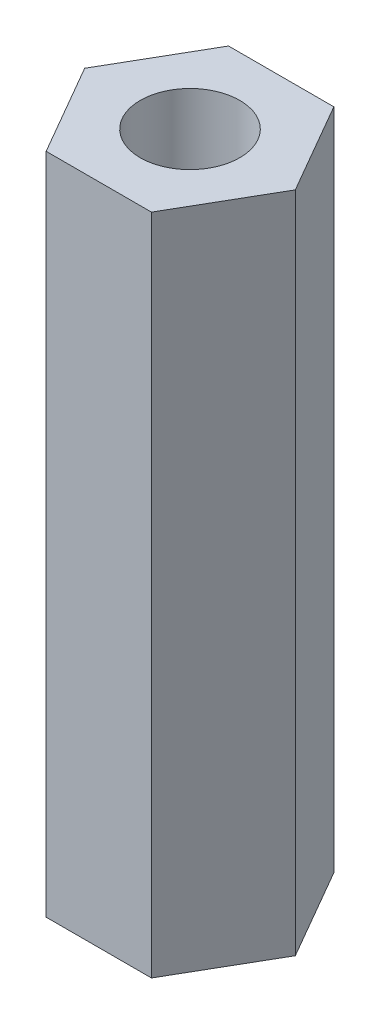
ISO-10303-21;
HEADER;
FILE_DESCRIPTION(('STEP AP214'),'2;1');
FILE_NAME('part.step','',(''),(''),'','','');
FILE_SCHEMA(('AUTOMOTIVE_DESIGN { 1 0 10303 214 1 1 1 1 }'));
ENDSEC;
DATA;
#1=APPLICATION_CONTEXT('core data for automotive mechanical design processes');
#2=APPLICATION_PROTOCOL_DEFINITION('international standard','automotive_design',2000,#1);
#3=PRODUCT_CONTEXT('',#1,'mechanical');
#4=PRODUCT('Part','Part','',(#3));
#5=PRODUCT_RELATED_PRODUCT_CATEGORY('part','',(#4));
#6=PRODUCT_DEFINITION_FORMATION('','',#4);
#7=PRODUCT_DEFINITION_CONTEXT('part definition',#1,'design');
#8=PRODUCT_DEFINITION('design','',#6,#7);
#9=PRODUCT_DEFINITION_SHAPE('','',#8);
#10=(LENGTH_UNIT() NAMED_UNIT(*) SI_UNIT(.MILLI.,.METRE.));
#11=(NAMED_UNIT(*) PLANE_ANGLE_UNIT() SI_UNIT($,.RADIAN.));
#12=(NAMED_UNIT(*) SI_UNIT($,.STERADIAN.) SOLID_ANGLE_UNIT());
#13=UNCERTAINTY_MEASURE_WITH_UNIT(LENGTH_MEASURE(1.E-05),#10,'distance_accuracy_value','');
#14=(GEOMETRIC_REPRESENTATION_CONTEXT(3) GLOBAL_UNCERTAINTY_ASSIGNED_CONTEXT((#13)) GLOBAL_UNIT_ASSIGNED_CONTEXT((#10,
#11,#12)) REPRESENTATION_CONTEXT('',''));
#15=CARTESIAN_POINT('',(0.,0.,0.));
#16=DIRECTION('',(0.,0.,1.));
#17=DIRECTION('',(1.,0.,0.));
#18=AXIS2_PLACEMENT_3D('',#15,#16,#17);
#19=CARTESIAN_POINT('',(0.,20.,0.));
#20=DIRECTION('',(0.,1.,0.));
#21=DIRECTION('',(0.,0.,1.));
#22=AXIS2_PLACEMENT_3D('',#19,#20,#21);
#23=PLANE('',#22);
#24=DIRECTION('',(0.5,0.,-0.866025403784439));
#25=VECTOR('',#24,1.);
#26=CARTESIAN_POINT('',(-5.73489304903012,20.,-4.82224059461863));
#27=LINE('',#26,#25);
#28=CARTESIAN_POINT('',(-5.73489304903012,20.,-4.82224059461863));
#29=VERTEX_POINT('',#28);
#30=CARTESIAN_POINT('',(-4.14717980875865,20.,-7.57224059461863));
#31=VERTEX_POINT('',#30);
#32=EDGE_CURVE('E146',#29,#31,#27,.T.);
#33=ORIENTED_EDGE('',*,*,#32,.T.);
#34=DIRECTION('',(-0.5,0.,-0.866025403784439));
#35=VECTOR('',#34,1.);
#36=CARTESIAN_POINT('',(-4.14717980875865,20.,-7.57224059461863));
#37=LINE('',#36,#35);
#38=CARTESIAN_POINT('',(-5.73489304903012,20.,-10.3222405946186));
#39=VERTEX_POINT('',#38);
#40=EDGE_CURVE('E94',#31,#39,#37,.T.);
#41=ORIENTED_EDGE('',*,*,#40,.T.);
#42=DIRECTION('',(-1.,0.,0.));
#43=VECTOR('',#42,1.);
#44=CARTESIAN_POINT('',(-5.73489304903012,20.,-10.3222405946186));
#45=LINE('',#44,#43);
#46=CARTESIAN_POINT('',(-8.91031952957306,20.,-10.3222405946186));
#47=VERTEX_POINT('',#46);
#48=EDGE_CURVE('E107',#39,#47,#45,.T.);
#49=ORIENTED_EDGE('',*,*,#48,.T.);
#50=DIRECTION('',(-0.5,0.,0.866025403784439));
#51=VECTOR('',#50,1.);
#52=CARTESIAN_POINT('',(-8.91031952957306,20.,-10.3222405946186));
#53=LINE('',#52,#51);
#54=CARTESIAN_POINT('',(-10.4980327698445,20.,-7.57224059461863));
#55=VERTEX_POINT('',#54);
#56=EDGE_CURVE('E101',#47,#55,#53,.T.);
#57=ORIENTED_EDGE('',*,*,#56,.T.);
#58=DIRECTION('',(0.5,0.,0.866025403784439));
#59=VECTOR('',#58,1.);
#60=CARTESIAN_POINT('',(-10.4980327698445,20.,-7.57224059461863));
#61=LINE('',#60,#59);
#62=CARTESIAN_POINT('',(-8.91031952957306,20.,-4.82224059461863));
#63=VERTEX_POINT('',#62);
#64=EDGE_CURVE('E105',#55,#63,#61,.T.);
#65=ORIENTED_EDGE('',*,*,#64,.T.);
#66=DIRECTION('',(1.,0.,0.));
#67=VECTOR('',#66,1.);
#68=CARTESIAN_POINT('',(-8.91031952957306,20.,-4.82224059461863));
#69=LINE('',#68,#67);
#70=EDGE_CURVE('E57',#63,#29,#69,.T.);
#71=ORIENTED_EDGE('',*,*,#70,.T.);
#72=EDGE_LOOP('',(#33,#41,#49,#57,#65,#71));
#73=FACE_BOUND('',#72,.T.);
#74=CARTESIAN_POINT('',(-7.32260628930159,20.,-7.57224059461863));
#75=DIRECTION('',(0.,1.,0.));
#76=DIRECTION('',(0.,0.,1.));
#77=AXIS2_PLACEMENT_3D('',#74,#75,#76);
#78=CIRCLE('',#77,1.5);
#79=CARTESIAN_POINT('',(-7.32260628930159,20.,-6.07224059461863));
#80=VERTEX_POINT('',#79);
#81=EDGE_CURVE('E134',#80,#80,#78,.T.);
#82=ORIENTED_EDGE('',*,*,#81,.F.);
#83=EDGE_LOOP('',(#82));
#84=FACE_BOUND('',#83,.T.);
#85=ADVANCED_FACE('F39',(#73,#84),#23,.T.);
#86=CARTESIAN_POINT('',(0.,0.,0.));
#87=DIRECTION('',(0.,1.,0.));
#88=DIRECTION('',(0.,0.,1.));
#89=AXIS2_PLACEMENT_3D('',#86,#87,#88);
#90=PLANE('',#89);
#91=DIRECTION('',(0.5,0.,-0.866025403784439));
#92=VECTOR('',#91,1.);
#93=CARTESIAN_POINT('',(-5.73489304903012,0.,-4.82224059461863));
#94=LINE('',#93,#92);
#95=CARTESIAN_POINT('',(-5.73489304903012,0.,-4.82224059461863));
#96=VERTEX_POINT('',#95);
#97=CARTESIAN_POINT('',(-4.14717980875865,0.,-7.57224059461863));
#98=VERTEX_POINT('',#97);
#99=EDGE_CURVE('E129',#96,#98,#94,.T.);
#100=ORIENTED_EDGE('',*,*,#99,.F.);
#101=DIRECTION('',(1.,0.,0.));
#102=VECTOR('',#101,1.);
#103=CARTESIAN_POINT('',(-8.91031952957306,0.,-4.82224059461863));
#104=LINE('',#103,#102);
#105=CARTESIAN_POINT('',(-8.91031952957306,0.,-4.82224059461863));
#106=VERTEX_POINT('',#105);
#107=EDGE_CURVE('E86',#106,#96,#104,.T.);
#108=ORIENTED_EDGE('',*,*,#107,.F.);
#109=DIRECTION('',(0.5,0.,0.866025403784439));
#110=VECTOR('',#109,1.);
#111=CARTESIAN_POINT('',(-10.4980327698445,0.,-7.57224059461863));
#112=LINE('',#111,#110);
#113=CARTESIAN_POINT('',(-10.4980327698445,0.,-7.57224059461863));
#114=VERTEX_POINT('',#113);
#115=EDGE_CURVE('E80',#114,#106,#112,.T.);
#116=ORIENTED_EDGE('',*,*,#115,.F.);
#117=DIRECTION('',(-0.5,0.,0.866025403784439));
#118=VECTOR('',#117,1.);
#119=CARTESIAN_POINT('',(-8.91031952957306,0.,-10.3222405946186));
#120=LINE('',#119,#118);
#121=CARTESIAN_POINT('',(-8.91031952957306,0.,-10.3222405946186));
#122=VERTEX_POINT('',#121);
#123=EDGE_CURVE('E116',#122,#114,#120,.T.);
#124=ORIENTED_EDGE('',*,*,#123,.F.);
#125=DIRECTION('',(-1.,0.,0.));
#126=VECTOR('',#125,1.);
#127=CARTESIAN_POINT('',(-5.73489304903012,0.,-10.3222405946186));
#128=LINE('',#127,#126);
#129=CARTESIAN_POINT('',(-5.73489304903012,0.,-10.3222405946186));
#130=VERTEX_POINT('',#129);
#131=EDGE_CURVE('E137',#130,#122,#128,.T.);
#132=ORIENTED_EDGE('',*,*,#131,.F.);
#133=DIRECTION('',(-0.5,0.,-0.866025403784439));
#134=VECTOR('',#133,1.);
#135=CARTESIAN_POINT('',(-4.14717980875865,0.,-7.57224059461863));
#136=LINE('',#135,#134);
#137=EDGE_CURVE('E133',#98,#130,#136,.T.);
#138=ORIENTED_EDGE('',*,*,#137,.F.);
#139=EDGE_LOOP('',(#100,#108,#116,#124,#132,#138));
#140=FACE_BOUND('',#139,.T.);
#141=CARTESIAN_POINT('',(-7.32260628930159,0.,-7.57224059461863));
#142=DIRECTION('',(0.,1.,0.));
#143=DIRECTION('',(0.,0.,1.));
#144=AXIS2_PLACEMENT_3D('',#141,#142,#143);
#145=CIRCLE('',#144,1.5);
#146=CARTESIAN_POINT('',(-7.32260628930159,0.,-6.07224059461863));
#147=VERTEX_POINT('',#146);
#148=EDGE_CURVE('E243',#147,#147,#145,.T.);
#149=ORIENTED_EDGE('',*,*,#148,.T.);
#150=EDGE_LOOP('',(#149));
#151=FACE_BOUND('',#150,.T.);
#152=ADVANCED_FACE('F159',(#140,#151),#90,.F.);
#153=CARTESIAN_POINT('',(-5.73489304903012,20.,-4.82224059461863));
#154=DIRECTION('',(-0.866025403784439,0.,-0.5));
#155=DIRECTION('',(-0.5,0.,0.866025403784439));
#156=AXIS2_PLACEMENT_3D('',#153,#154,#155);
#157=PLANE('',#156);
#158=ORIENTED_EDGE('',*,*,#99,.T.);
#159=DIRECTION('',(0.,-1.,0.));
#160=VECTOR('',#159,1.);
#161=CARTESIAN_POINT('',(-4.14717980875865,20.,-7.57224059461863));
#162=LINE('',#161,#160);
#163=EDGE_CURVE('E11',#31,#98,#162,.T.);
#164=ORIENTED_EDGE('',*,*,#163,.F.);
#165=ORIENTED_EDGE('',*,*,#32,.F.);
#166=DIRECTION('',(0.,-1.,0.));
#167=VECTOR('',#166,1.);
#168=CARTESIAN_POINT('',(-5.73489304903012,20.,-4.82224059461863));
#169=LINE('',#168,#167);
#170=EDGE_CURVE('E125',#29,#96,#169,.T.);
#171=ORIENTED_EDGE('',*,*,#170,.T.);
#172=EDGE_LOOP('',(#158,#164,#165,#171));
#173=FACE_BOUND('',#172,.T.);
#174=ADVANCED_FACE('F41',(#173),#157,.F.);
#175=CARTESIAN_POINT('',(-4.14717980875865,20.,-7.57224059461863));
#176=DIRECTION('',(-0.866025403784439,0.,0.5));
#177=DIRECTION('',(0.5,0.,0.866025403784439));
#178=AXIS2_PLACEMENT_3D('',#175,#176,#177);
#179=PLANE('',#178);
#180=ORIENTED_EDGE('',*,*,#137,.T.);
#181=DIRECTION('',(0.,-1.,0.));
#182=VECTOR('',#181,1.);
#183=CARTESIAN_POINT('',(-5.73489304903012,20.,-10.3222405946186));
#184=LINE('',#183,#182);
#185=EDGE_CURVE('E49',#39,#130,#184,.T.);
#186=ORIENTED_EDGE('',*,*,#185,.F.);
#187=ORIENTED_EDGE('',*,*,#40,.F.);
#188=ORIENTED_EDGE('',*,*,#163,.T.);
#189=EDGE_LOOP('',(#180,#186,#187,#188));
#190=FACE_BOUND('',#189,.T.);
#191=ADVANCED_FACE('F184',(#190),#179,.F.);
#192=CARTESIAN_POINT('',(-5.73489304903012,20.,-10.3222405946186));
#193=DIRECTION('',(0.,0.,1.));
#194=DIRECTION('',(1.,0.,0.));
#195=AXIS2_PLACEMENT_3D('',#192,#193,#194);
#196=PLANE('',#195);
#197=ORIENTED_EDGE('',*,*,#131,.T.);
#198=DIRECTION('',(0.,-1.,0.));
#199=VECTOR('',#198,1.);
#200=CARTESIAN_POINT('',(-8.91031952957306,20.,-10.3222405946186));
#201=LINE('',#200,#199);
#202=EDGE_CURVE('E118',#47,#122,#201,.T.);
#203=ORIENTED_EDGE('',*,*,#202,.F.);
#204=ORIENTED_EDGE('',*,*,#48,.F.);
#205=ORIENTED_EDGE('',*,*,#185,.T.);
#206=EDGE_LOOP('',(#197,#203,#204,#205));
#207=FACE_BOUND('',#206,.T.);
#208=ADVANCED_FACE('F156',(#207),#196,.F.);
#209=CARTESIAN_POINT('',(-8.91031952957306,20.,-10.3222405946186));
#210=DIRECTION('',(0.866025403784439,0.,0.5));
#211=DIRECTION('',(0.5,0.,-0.866025403784439));
#212=AXIS2_PLACEMENT_3D('',#209,#210,#211);
#213=PLANE('',#212);
#214=ORIENTED_EDGE('',*,*,#123,.T.);
#215=DIRECTION('',(0.,-1.,0.));
#216=VECTOR('',#215,1.);
#217=CARTESIAN_POINT('',(-10.4980327698445,20.,-7.57224059461863));
#218=LINE('',#217,#216);
#219=EDGE_CURVE('E113',#55,#114,#218,.T.);
#220=ORIENTED_EDGE('',*,*,#219,.F.);
#221=ORIENTED_EDGE('',*,*,#56,.F.);
#222=ORIENTED_EDGE('',*,*,#202,.T.);
#223=EDGE_LOOP('',(#214,#220,#221,#222));
#224=FACE_BOUND('',#223,.T.);
#225=ADVANCED_FACE('F114',(#224),#213,.F.);
#226=CARTESIAN_POINT('',(-10.4980327698445,20.,-7.57224059461863));
#227=DIRECTION('',(0.866025403784439,0.,-0.5));
#228=DIRECTION('',(-0.5,0.,-0.866025403784439));
#229=AXIS2_PLACEMENT_3D('',#226,#227,#228);
#230=PLANE('',#229);
#231=ORIENTED_EDGE('',*,*,#115,.T.);
#232=DIRECTION('',(0.,-1.,0.));
#233=VECTOR('',#232,1.);
#234=CARTESIAN_POINT('',(-8.91031952957306,20.,-4.82224059461863));
#235=LINE('',#234,#233);
#236=EDGE_CURVE('E119',#63,#106,#235,.T.);
#237=ORIENTED_EDGE('',*,*,#236,.F.);
#238=ORIENTED_EDGE('',*,*,#64,.F.);
#239=ORIENTED_EDGE('',*,*,#219,.T.);
#240=EDGE_LOOP('',(#231,#237,#238,#239));
#241=FACE_BOUND('',#240,.T.);
#242=ADVANCED_FACE('F121',(#241),#230,.F.);
#243=CARTESIAN_POINT('',(-8.91031952957306,20.,-4.82224059461863));
#244=DIRECTION('',(0.,0.,-1.));
#245=DIRECTION('',(-1.,0.,0.));
#246=AXIS2_PLACEMENT_3D('',#243,#244,#245);
#247=PLANE('',#246);
#248=ORIENTED_EDGE('',*,*,#107,.T.);
#249=ORIENTED_EDGE('',*,*,#170,.F.);
#250=ORIENTED_EDGE('',*,*,#70,.F.);
#251=ORIENTED_EDGE('',*,*,#236,.T.);
#252=EDGE_LOOP('',(#248,#249,#250,#251));
#253=FACE_BOUND('',#252,.T.);
#254=ADVANCED_FACE('F164',(#253),#247,.F.);
#255=CARTESIAN_POINT('',(-7.32260628930159,20.,-7.57224059461863));
#256=DIRECTION('',(0.,-1.,0.));
#257=DIRECTION('',(0.,0.,-1.));
#258=AXIS2_PLACEMENT_3D('',#255,#256,#257);
#259=CYLINDRICAL_SURFACE('',#258,1.5);
#260=ORIENTED_EDGE('',*,*,#81,.T.);
#261=EDGE_LOOP('',(#260));
#262=FACE_BOUND('',#261,.T.);
#263=ORIENTED_EDGE('',*,*,#148,.F.);
#264=EDGE_LOOP('',(#263));
#265=FACE_BOUND('',#264,.T.);
#266=ADVANCED_FACE('F166',(#262,#265),#259,.F.);
#267=CLOSED_SHELL('',(#85,#152,#174,#191,#208,#225,#242,#254,#266));
#268=MANIFOLD_SOLID_BREP('B2',#267);
#269=ADVANCED_BREP_SHAPE_REPRESENTATION('',(#18,#268),#14);
#270=SHAPE_DEFINITION_REPRESENTATION(#9,#269);
ENDSEC;
END-ISO-10303-21;
